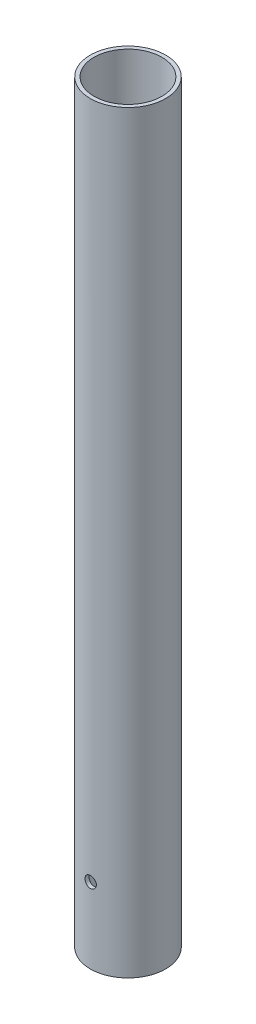
ISO-10303-21;
HEADER;
FILE_DESCRIPTION(('STEP AP214'),'2;1');
FILE_NAME('part.step','',(''),(''),'','','');
FILE_SCHEMA(('AUTOMOTIVE_DESIGN { 1 0 10303 214 1 1 1 1 }'));
ENDSEC;
DATA;
#1=APPLICATION_CONTEXT('core data for automotive mechanical design processes');
#2=APPLICATION_PROTOCOL_DEFINITION('international standard','automotive_design',2000,#1);
#3=PRODUCT_CONTEXT('',#1,'mechanical');
#4=PRODUCT('Part','Part','',(#3));
#5=PRODUCT_RELATED_PRODUCT_CATEGORY('part','',(#4));
#6=PRODUCT_DEFINITION_FORMATION('','',#4);
#7=PRODUCT_DEFINITION_CONTEXT('part definition',#1,'design');
#8=PRODUCT_DEFINITION('design','',#6,#7);
#9=PRODUCT_DEFINITION_SHAPE('','',#8);
#10=(LENGTH_UNIT() NAMED_UNIT(*) SI_UNIT(.MILLI.,.METRE.));
#11=(NAMED_UNIT(*) PLANE_ANGLE_UNIT() SI_UNIT($,.RADIAN.));
#12=(NAMED_UNIT(*) SI_UNIT($,.STERADIAN.) SOLID_ANGLE_UNIT());
#13=UNCERTAINTY_MEASURE_WITH_UNIT(LENGTH_MEASURE(1.E-05),#10,'distance_accuracy_value','');
#14=(GEOMETRIC_REPRESENTATION_CONTEXT(3) GLOBAL_UNCERTAINTY_ASSIGNED_CONTEXT((#13)) GLOBAL_UNIT_ASSIGNED_CONTEXT((#10,
#11,#12)) REPRESENTATION_CONTEXT('',''));
#15=CARTESIAN_POINT('',(0.,0.,0.));
#16=DIRECTION('',(0.,0.,1.));
#17=DIRECTION('',(1.,0.,0.));
#18=AXIS2_PLACEMENT_3D('',#15,#16,#17);
#19=CARTESIAN_POINT('',(0.,200.,0.));
#20=DIRECTION('',(0.,1.,0.));
#21=DIRECTION('',(0.,0.,1.));
#22=AXIS2_PLACEMENT_3D('',#19,#20,#21);
#23=PLANE('',#22);
#24=CARTESIAN_POINT('',(0.,200.,0.));
#25=DIRECTION('',(0.,1.,0.));
#26=DIRECTION('',(0.,0.,1.));
#27=AXIS2_PLACEMENT_3D('',#24,#25,#26);
#28=CIRCLE('',#27,10.);
#29=CARTESIAN_POINT('',(0.,200.,10.));
#30=VERTEX_POINT('',#29);
#31=EDGE_CURVE('E10',#30,#30,#28,.T.);
#32=ORIENTED_EDGE('',*,*,#31,.T.);
#33=EDGE_LOOP('',(#32));
#34=FACE_BOUND('',#33,.T.);
#35=CARTESIAN_POINT('',(0.,200.,0.));
#36=DIRECTION('',(0.,1.,0.));
#37=DIRECTION('',(0.,0.,1.));
#38=AXIS2_PLACEMENT_3D('',#35,#36,#37);
#39=CIRCLE('',#38,9.);
#40=CARTESIAN_POINT('',(0.,200.,9.));
#41=VERTEX_POINT('',#40);
#42=EDGE_CURVE('E49',#41,#41,#39,.T.);
#43=ORIENTED_EDGE('',*,*,#42,.F.);
#44=EDGE_LOOP('',(#43));
#45=FACE_BOUND('',#44,.T.);
#46=ADVANCED_FACE('F31',(#34,#45),#23,.T.);
#47=CARTESIAN_POINT('',(0.,0.,0.));
#48=DIRECTION('',(0.,1.,0.));
#49=DIRECTION('',(0.,0.,1.));
#50=AXIS2_PLACEMENT_3D('',#47,#48,#49);
#51=PLANE('',#50);
#52=CARTESIAN_POINT('',(0.,0.,0.));
#53=DIRECTION('',(0.,1.,0.));
#54=DIRECTION('',(0.,0.,1.));
#55=AXIS2_PLACEMENT_3D('',#52,#53,#54);
#56=CIRCLE('',#55,10.);
#57=CARTESIAN_POINT('',(0.,0.,10.));
#58=VERTEX_POINT('',#57);
#59=EDGE_CURVE('E44',#58,#58,#56,.T.);
#60=ORIENTED_EDGE('',*,*,#59,.F.);
#61=EDGE_LOOP('',(#60));
#62=FACE_BOUND('',#61,.T.);
#63=CARTESIAN_POINT('',(0.,0.,0.));
#64=DIRECTION('',(0.,1.,0.));
#65=DIRECTION('',(0.,0.,1.));
#66=AXIS2_PLACEMENT_3D('',#63,#64,#65);
#67=CIRCLE('',#66,9.);
#68=CARTESIAN_POINT('',(0.,0.,9.));
#69=VERTEX_POINT('',#68);
#70=EDGE_CURVE('E52',#69,#69,#67,.T.);
#71=ORIENTED_EDGE('',*,*,#70,.T.);
#72=EDGE_LOOP('',(#71));
#73=FACE_BOUND('',#72,.T.);
#74=ADVANCED_FACE('F85',(#62,#73),#51,.F.);
#75=CARTESIAN_POINT('',(0.,200.,0.));
#76=DIRECTION('',(0.,-1.,0.));
#77=DIRECTION('',(0.,0.,-1.));
#78=AXIS2_PLACEMENT_3D('',#75,#76,#77);
#79=CYLINDRICAL_SURFACE('',#78,10.);
#80=CARTESIAN_POINT('',(0.,21.5,-10.));
#81=CARTESIAN_POINT('',(-0.0837515444816428,21.4999965461847,-9.99999865771297));
#82=CARTESIAN_POINT('',(-0.167551685082133,21.4929619991594,-9.9989368253704));
#83=CARTESIAN_POINT('',(-0.332809627994915,21.4650168000173,-9.99480315973187));
#84=CARTESIAN_POINT('',(-0.41426506897423,21.4440926370551,-9.99172936938473));
#85=CARTESIAN_POINT('',(-0.572418086221861,21.3890074950324,-9.98391721219526));
#86=CARTESIAN_POINT('',(-0.649119207826801,21.3548565204941,-9.97918010370919));
#87=CARTESIAN_POINT('',(-0.795690428635256,21.2743116205831,-9.96856475911724));
#88=CARTESIAN_POINT('',(-0.865561474725191,21.2279193955826,-9.96268668152773));
#89=CARTESIAN_POINT('',(-0.997046719562128,21.1238227350601,-9.95039170991452));
#90=CARTESIAN_POINT('',(-1.0585998322255,21.0660415437918,-9.94397133890331));
#91=CARTESIAN_POINT('',(-1.17117490668949,20.9409723111061,-9.93134261133238));
#92=CARTESIAN_POINT('',(-1.22219626272936,20.8736837232215,-9.92513426698505));
#93=CARTESIAN_POINT('',(-1.31249729499943,20.7310993564775,-9.91359877458726));
#94=CARTESIAN_POINT('',(-1.35171787037205,20.6557657530187,-9.90827611975031));
#95=CARTESIAN_POINT('',(-1.41692632171056,20.4994871793546,-9.89916211306268));
#96=CARTESIAN_POINT('',(-1.44291491889163,20.4185425152561,-9.89537067775448));
#97=CARTESIAN_POINT('',(-1.48073198798911,20.2539819581283,-9.88978256218673));
#98=CARTESIAN_POINT('',(-1.49266503640518,20.170390606592,-9.8879711574125));
#99=CARTESIAN_POINT('',(-1.50235624033932,20.0023738340127,-9.88650348970582));
#100=CARTESIAN_POINT('',(-1.50011520973796,19.9179484611375,-9.88684710303147));
#101=CARTESIAN_POINT('',(-1.48160733250788,19.7513989198059,-9.88963718352409));
#102=CARTESIAN_POINT('',(-1.4654569592775,19.6692614735152,-9.89206618761549));
#103=CARTESIAN_POINT('',(-1.41977117403734,19.5088756311285,-9.89872608126367));
#104=CARTESIAN_POINT('',(-1.39023538337812,19.4306273451193,-9.90295702179379));
#105=CARTESIAN_POINT('',(-1.31849603529737,19.2798866287171,-9.91276335545481));
#106=CARTESIAN_POINT('',(-1.27624314283198,19.2074180309076,-9.91834396766526));
#107=CARTESIAN_POINT('',(-1.18030413128955,19.0705554042181,-9.93021707574548));
#108=CARTESIAN_POINT('',(-1.12661726182478,19.0061619057306,-9.93650961832501));
#109=CARTESIAN_POINT('',(-1.00869493078248,18.8866023392603,-9.94917473056209));
#110=CARTESIAN_POINT('',(-0.944359329642002,18.8315350097137,-9.95554747112815));
#111=CARTESIAN_POINT('',(-0.807307089894185,18.7329640654927,-9.96759647648462));
#112=CARTESIAN_POINT('',(-0.734590414588169,18.6894605014561,-9.9732727382251));
#113=CARTESIAN_POINT('',(-0.582754598213683,18.6152469135004,-9.98329515585393));
#114=CARTESIAN_POINT('',(-0.503631677836776,18.5845445081597,-9.98764051925428));
#115=CARTESIAN_POINT('',(-0.341273182487057,18.5368906103146,-9.99450490557069));
#116=CARTESIAN_POINT('',(-0.258037885952597,18.5199381881844,-9.99702405195467));
#117=CARTESIAN_POINT('',(-0.0906695676436442,18.5003967701833,-9.99993581133871));
#118=CARTESIAN_POINT('',(-0.00655273187046845,18.4976720286207,-10.0003485209039));
#119=CARTESIAN_POINT('',(0.160936677662285,18.506303005311,-9.99905561015226));
#120=CARTESIAN_POINT('',(0.244309274381879,18.5176582876681,-9.99735005541369));
#121=CARTESIAN_POINT('',(0.40753238743141,18.5540141001775,-9.99202468615333));
#122=CARTESIAN_POINT('',(0.48739796307984,18.5789484960308,-9.98841415207984));
#123=CARTESIAN_POINT('',(0.641814958643002,18.6416849974618,-9.97968235658369));
#124=CARTESIAN_POINT('',(0.716366128795103,18.6794877073336,-9.97456102421565));
#125=CARTESIAN_POINT('',(0.858634979291924,18.7672062245639,-9.96332682468686));
#126=CARTESIAN_POINT('',(0.926299009891569,18.8172081400128,-9.95720701626745));
#127=CARTESIAN_POINT('',(1.05232367317771,18.9277858116287,-9.94467863012165));
#128=CARTESIAN_POINT('',(1.11068376479341,18.9883621823247,-9.93827003562867));
#129=CARTESIAN_POINT('',(1.21693784957196,19.1189735331765,-9.92582264304494));
#130=CARTESIAN_POINT('',(1.26474084747421,19.1890829251948,-9.91978736017588));
#131=CARTESIAN_POINT('',(1.34789129270584,19.3364160405118,-9.90883219104903));
#132=CARTESIAN_POINT('',(1.38323907656436,19.4136395715215,-9.90391227465628));
#133=CARTESIAN_POINT('',(1.44033467323944,19.5727375336231,-9.89577033008645));
#134=CARTESIAN_POINT('',(1.46213037141636,19.6545944609712,-9.89254233006438));
#135=CARTESIAN_POINT('',(1.49165549501586,19.8208590154351,-9.88813382297802));
#136=CARTESIAN_POINT('',(1.49938589183067,19.9052664659947,-9.88695317451771));
#137=CARTESIAN_POINT('',(1.5005378666944,20.0733290633158,-9.88677832610841));
#138=CARTESIAN_POINT('',(1.49410252167313,20.1569832417569,-9.88776226333502));
#139=CARTESIAN_POINT('',(1.46741229544379,20.3220052633235,-9.89175820611174));
#140=CARTESIAN_POINT('',(1.44715743638627,20.4033731101134,-9.89477020841118));
#141=CARTESIAN_POINT('',(1.39345373518665,20.5614730822343,-9.90247526112297));
#142=CARTESIAN_POINT('',(1.36001489324314,20.6382086704334,-9.90716703716075));
#143=CARTESIAN_POINT('',(1.28090667642309,20.7850036338024,-9.91770454557702));
#144=CARTESIAN_POINT('',(1.23523688741502,20.8550627828036,-9.92355031702724));
#145=CARTESIAN_POINT('',(1.13244337659164,20.9872430579752,-9.93580743364938));
#146=CARTESIAN_POINT('',(1.07521369039806,21.0492813332471,-9.94222367881967));
#147=CARTESIAN_POINT('',(0.951148841082834,21.1629245547878,-9.95485788826636));
#148=CARTESIAN_POINT('',(0.88431144835094,21.2145270725762,-9.96107580610759));
#149=CARTESIAN_POINT('',(0.742495707543721,21.3060876766074,-9.9726518579052));
#150=CARTESIAN_POINT('',(0.667474576764759,21.3459801092148,-9.9780050712882));
#151=CARTESIAN_POINT('',(0.511751870248718,21.412538516758,-9.98720028802959));
#152=CARTESIAN_POINT('',(0.431056277096703,21.4392181900537,-9.99104385565757));
#153=CARTESIAN_POINT('',(0.291665727889329,21.4725413427101,-9.99590939261505));
#154=CARTESIAN_POINT('',(0.233831133495278,21.4828226015388,-9.99743549179557));
#155=CARTESIAN_POINT('',(0.117338971600125,21.4965530977126,-9.99948125947896));
#156=CARTESIAN_POINT('',(0.0586814143344173,21.5000024199525,-10.0000009404877));
#157=CARTESIAN_POINT('',(0.,21.5,-10.));
#158=B_SPLINE_CURVE_WITH_KNOTS('',3,(#80,#81,#82,#83,#84,#85,#86,#87,#88,#89,#90,#91,#92,#93,
#94,#95,#96,#97,#98,#99,#100,#101,#102,#103,#104,#105,#106,#107,#108,#109,#110,#111,#112,#113,
#114,#115,#116,#117,#118,#119,#120,#121,#122,#123,#124,#125,#126,#127,#128,#129,#130,#131,#132,
#133,#134,#135,#136,#137,#138,#139,#140,#141,#142,#143,#144,#145,#146,#147,#148,#149,#150,#151,
#152,#153,#154,#155,#156,#157),.UNSPECIFIED.,.T.,.F.,(4,2,2,2,2,2,2,2,2,2,2,2,2,2,2,2,2,2,2,2,2,
2,2,2,2,2,2,2,2,2,2,2,2,2,2,2,2,2,4),(0.,0.251040205031664,0.502324962929151,0.753420023583238,
1.0044802241976,1.25729416136843,1.5101226357258,1.76419702395375,2.01825756225506,
2.27041564605925,2.52255925098983,2.77261177195747,3.02267136690362,3.27371383476159,
3.52477278308534,3.77834291255409,4.03191415238669,4.28563608984875,4.53934087193402,
4.79062058544256,5.04189251991155,5.29195148965949,5.54202220376274,5.79391188036908,
6.0458162002863,6.29981366584673,6.55380426808833,6.80689223457169,7.05996272137177,
7.31048888261065,7.56101464229564,7.81135073984147,8.0616953146688,8.31444829965722,
8.56726003468733,8.82146323384734,9.07540233261442,9.25129851978809,9.42719252123291),.UNSPECIFIED.);
#159=CARTESIAN_POINT('',(0.,21.5,-10.));
#160=VERTEX_POINT('',#159);
#161=EDGE_CURVE('E75',#160,#160,#158,.T.);
#162=ORIENTED_EDGE('',*,*,#161,.T.);
#163=EDGE_LOOP('',(#162));
#164=FACE_BOUND('',#163,.T.);
#165=CARTESIAN_POINT('',(1.5,20.,9.88685996664259));
#166=CARTESIAN_POINT('',(1.49999654107284,19.91625443071,9.88686136668593));
#167=CARTESIAN_POINT('',(1.49296296388491,19.8324602492493,9.88793551739101));
#168=CARTESIAN_POINT('',(1.46502196657001,19.6672146851169,9.8921131480324));
#169=CARTESIAN_POINT('',(1.44410101402628,19.58576566852,9.8952186073143));
#170=CARTESIAN_POINT('',(1.38902526098084,19.4276262445531,9.90309938986228));
#171=CARTESIAN_POINT('',(1.35488061681397,19.3509322374578,9.90787343131536));
#172=CARTESIAN_POINT('',(1.27435063087791,19.2043729692279,9.91855194113145));
#173=CARTESIAN_POINT('',(1.22796697429872,19.1345067697857,9.92445625383668));
#174=CARTESIAN_POINT('',(1.12387902418558,19.0030161832457,9.9367828924804));
#175=CARTESIAN_POINT('',(1.0660960558482,18.9414543865933,9.94320862458057));
#176=CARTESIAN_POINT('',(0.941019605444373,18.8288625143445,9.95582368169047));
#177=CARTESIAN_POINT('',(0.873725600786529,18.777833017833,9.96201299368615));
#178=CARTESIAN_POINT('',(0.731136358052745,18.6875233683086,9.97349347428185));
#179=CARTESIAN_POINT('',(0.655804227365767,18.6483008496775,9.97878018435569));
#180=CARTESIAN_POINT('',(0.499528850106974,18.5830884011918,9.98782206746405));
#181=CARTESIAN_POINT('',(0.418585900270676,18.5570977721571,9.99157732141945));
#182=CARTESIAN_POINT('',(0.254031123090568,18.5192766114692,9.99710914797782));
#183=CARTESIAN_POINT('',(0.170443884389865,18.5073412736128,9.99890035887344));
#184=CARTESIAN_POINT('',(0.00243520401947719,18.4976440651751,10.0003524476958));
#185=CARTESIAN_POINT('',(-0.0819861910157481,18.4998814066803,10.0000134440494));
#186=CARTESIAN_POINT('',(-0.248551718200522,18.5183833377624,9.99725499660796));
#187=CARTESIAN_POINT('',(-0.330708691400009,18.5345351717915,9.99485227652479));
#188=CARTESIAN_POINT('',(-0.491132829143139,18.5802306063226,9.98825500227851));
#189=CARTESIAN_POINT('',(-0.569399893513483,18.6097745515014,9.98406040199739));
#190=CARTESIAN_POINT('',(-0.720163780770318,18.6815309969171,9.97432193873206));
#191=CARTESIAN_POINT('',(-0.792637672323598,18.7237909651087,9.96877303515638));
#192=CARTESIAN_POINT('',(-0.929507907150179,18.81974519367,9.95694438245421));
#193=CARTESIAN_POINT('',(-0.993903718271737,18.8734402067069,9.95066458523184));
#194=CARTESIAN_POINT('',(-1.11345448272265,18.9913684488266,9.93800158192627));
#195=CARTESIAN_POINT('',(-1.16851232950947,19.0557001219701,9.93161796623256));
#196=CARTESIAN_POINT('',(-1.26706599338813,19.1927410771237,9.91952704453523));
#197=CARTESIAN_POINT('',(-1.31056173927999,19.2654504107199,9.91381974269649));
#198=CARTESIAN_POINT('',(-1.38476964534605,19.4172839629406,9.90372775286855));
#199=CARTESIAN_POINT('',(-1.41547182270082,19.4964131336624,9.89934409845291));
#200=CARTESIAN_POINT('',(-1.46312336208879,19.6587852551474,9.89241402899059));
#201=CARTESIAN_POINT('',(-1.48007369337326,19.7420279155468,9.88986748446299));
#202=CARTESIAN_POINT('',(-1.49960720086656,19.9094000895775,9.88692451395027));
#203=CARTESIAN_POINT('',(-1.50232803265052,19.9935131882015,9.88650748802574));
#204=CARTESIAN_POINT('',(-1.49369057019819,20.1609941948173,9.88781607937153));
#205=CARTESIAN_POINT('',(-1.48233271282302,20.2443621258508,9.88954163015778));
#206=CARTESIAN_POINT('',(-1.44597702952766,20.4075598179656,9.89492202461453));
#207=CARTESIAN_POINT('',(-1.42104778527821,20.4874052049416,9.89856716482858));
#208=CARTESIAN_POINT('',(-1.35832831947087,20.6417840920486,9.90736801825768));
#209=CARTESIAN_POINT('',(-1.32053746276389,20.7163173296282,9.91252380607176));
#210=CARTESIAN_POINT('',(-1.23283677995324,20.858573260335,9.92381355687063));
#211=CARTESIAN_POINT('',(-1.18283784561766,20.9262404472798,9.92995459279988));
#212=CARTESIAN_POINT('',(-1.07226416837201,21.0522728598738,9.94250159433355));
#213=CARTESIAN_POINT('',(-1.0116888274468,21.1106375591812,9.94890757490292));
#214=CARTESIAN_POINT('',(-0.881075619628183,21.2169026066336,9.96132705217386));
#215=CARTESIAN_POINT('',(-0.810963126771956,21.2647117282425,9.96733683460423));
#216=CARTESIAN_POINT('',(-0.663622080263679,21.3478729052626,9.97822905032016));
#217=CARTESIAN_POINT('',(-0.586393721360436,21.383225301465,9.98311151444563));
#218=CARTESIAN_POINT('',(-0.427297995861143,21.440323742488,9.99118269660795));
#219=CARTESIAN_POINT('',(-0.345448858754299,21.4621196670784,9.99437761717899));
#220=CARTESIAN_POINT('',(-0.17920081550119,21.4916478795375,9.99873976656896));
#221=CARTESIAN_POINT('',(-0.0948020781305786,21.4993810962491,9.99990712930801));
#222=CARTESIAN_POINT('',(0.0732645908608203,21.5005417045494,10.0000812905914));
#223=CARTESIAN_POINT('',(0.156931570212054,21.494108680877,9.99910917023796));
#224=CARTESIAN_POINT('',(0.321979795323109,21.4674186115792,9.99515610519141));
#225=CARTESIAN_POINT('',(0.403361048396515,21.4471616101914,9.99217516692666));
#226=CARTESIAN_POINT('',(0.561489374379663,21.3934481244298,9.98453786742463));
#227=CARTESIAN_POINT('',(0.638239793148784,21.3600013048611,9.97988273316947));
#228=CARTESIAN_POINT('',(0.785061117896604,21.2808725120169,9.96940834495499));
#229=CARTESIAN_POINT('',(0.85513180692071,21.2351901415197,9.96358905320338));
#230=CARTESIAN_POINT('',(0.987312585191961,21.1323823011708,9.95136510636178));
#231=CARTESIAN_POINT('',(1.04934206644639,21.0751537741837,9.94495548425942));
#232=CARTESIAN_POINT('',(1.16296808390268,20.9510949269195,9.93231001689001));
#233=CARTESIAN_POINT('',(1.21456216798984,20.8842623561757,9.92607421276291));
#234=CARTESIAN_POINT('',(1.30611310822974,20.7424510167675,9.91444484029116));
#235=CARTESIAN_POINT('',(1.34600294291209,20.6674285829782,9.90905620156985));
#236=CARTESIAN_POINT('',(1.41255613872045,20.5117032232367,9.89978909110724));
#237=CARTESIAN_POINT('',(1.43923322574898,20.4310062921422,9.89590905307931));
#238=CARTESIAN_POINT('',(1.47254951890026,20.2916225637435,9.89099485524825));
#239=CARTESIAN_POINT('',(1.4828276978042,20.2337966030757,9.88945249382379));
#240=CARTESIAN_POINT('',(1.49655410576574,20.1173217082656,9.88738456567011));
#241=CARTESIAN_POINT('',(1.50000242335076,20.0586727848004,9.88685898576155));
#242=CARTESIAN_POINT('',(1.5,20.,9.88685996664259));
#243=B_SPLINE_CURVE_WITH_KNOTS('',3,(#165,#166,#167,#168,#169,#170,#171,#172,#173,#174,#175,
#176,#177,#178,#179,#180,#181,#182,#183,#184,#185,#186,#187,#188,#189,#190,#191,#192,#193,#194,
#195,#196,#197,#198,#199,#200,#201,#202,#203,#204,#205,#206,#207,#208,#209,#210,#211,#212,#213,
#214,#215,#216,#217,#218,#219,#220,#221,#222,#223,#224,#225,#226,#227,#228,#229,#230,#231,#232,
#233,#234,#235,#236,#237,#238,#239,#240,#241,#242),.UNSPECIFIED.,.T.,.F.,(4,2,2,2,2,2,2,2,2,2,2,
2,2,2,2,2,2,2,2,2,2,2,2,2,2,2,2,2,2,2,2,2,2,2,2,2,2,2,4),(0.,0.251022251804869,
0.502289469561804,0.753364085335676,1.00440414866133,1.25724158649108,1.51009292207817,
1.76415922105782,2.01821209364501,2.27035832534397,2.52249053939374,2.77259862515728,
3.02271314839402,3.27377316386454,3.52484970949273,3.7783954466627,4.0319427451435,
4.28568751773138,4.53941440444341,4.79068214603744,5.04194209099919,5.29194394807375,
5.54195815286118,5.79385486001303,6.04576581461802,6.29977537753517,6.55377799071855,
6.80684040891091,7.05988611170474,7.31044963622327,7.56101235892824,7.81139182257834,
8.06177941567107,8.3145095001097,8.56729890236863,8.82150878824932,9.07545403445564,
9.25132441891614,9.42719252376193),.UNSPECIFIED.);
#244=CARTESIAN_POINT('',(1.5,20.,9.88685996664259));
#245=VERTEX_POINT('',#244);
#246=EDGE_CURVE('E71',#245,#245,#243,.T.);
#247=ORIENTED_EDGE('',*,*,#246,.T.);
#248=EDGE_LOOP('',(#247));
#249=FACE_BOUND('',#248,.T.);
#250=ORIENTED_EDGE('',*,*,#31,.F.);
#251=EDGE_LOOP('',(#250));
#252=FACE_BOUND('',#251,.T.);
#253=ORIENTED_EDGE('',*,*,#59,.T.);
#254=EDGE_LOOP('',(#253));
#255=FACE_BOUND('',#254,.T.);
#256=ADVANCED_FACE('F33',(#164,#249,#252,#255),#79,.T.);
#257=CARTESIAN_POINT('',(0.,200.,0.));
#258=DIRECTION('',(0.,-1.,0.));
#259=DIRECTION('',(0.,0.,-1.));
#260=AXIS2_PLACEMENT_3D('',#257,#258,#259);
#261=CYLINDRICAL_SURFACE('',#260,9.);
#262=CARTESIAN_POINT('',(0.,21.5,-9.));
#263=CARTESIAN_POINT('',(-0.0836345429749295,21.4999966466313,-8.99999856701294));
#264=CARTESIAN_POINT('',(-0.167314729103294,21.4929816350186,-8.9988220674782));
#265=CARTESIAN_POINT('',(-0.332328133003827,21.4651186047408,-8.99424206964832));
#266=CARTESIAN_POINT('',(-0.413659120775549,21.444257865853,-8.99083652354334));
#267=CARTESIAN_POINT('',(-0.571562848327587,21.3893507308443,-8.9821804094187));
#268=CARTESIAN_POINT('',(-0.64813942105914,21.3553151206157,-8.97693135095516));
#269=CARTESIAN_POINT('',(-0.794485105186767,21.2750526247686,-8.96516536249242));
#270=CARTESIAN_POINT('',(-0.864254993927156,21.2288271335102,-8.9586485775266));
#271=CARTESIAN_POINT('',(-0.99568356857501,21.1250269497077,-8.94499990474988));
#272=CARTESIAN_POINT('',(-1.05726774212098,21.0673585312183,-8.93786323088914));
#273=CARTESIAN_POINT('',(-1.16993309919596,20.9425112189163,-8.92381576126039));
#274=CARTESIAN_POINT('',(-1.22101361963459,20.875331725126,-8.916904979776));
#275=CARTESIAN_POINT('',(-1.31152027536308,20.7328574202818,-8.90404539455868));
#276=CARTESIAN_POINT('',(-1.3508727317166,20.6575151979171,-8.89810277454982));
#277=CARTESIAN_POINT('',(-1.41633501924673,20.5011742614196,-8.88791873876805));
#278=CARTESIAN_POINT('',(-1.44244574493937,20.4201759297934,-8.88367720808584));
#279=CARTESIAN_POINT('',(-1.48044862667089,20.2556118350861,-8.87742322105653));
#280=CARTESIAN_POINT('',(-1.49246941748124,20.1720765580992,-8.8753906109142));
#281=CARTESIAN_POINT('',(-1.50235003517393,20.0041518338699,-8.87372363361989));
#282=CARTESIAN_POINT('',(-1.5002108642334,19.9197624474996,-8.87408909674328));
#283=CARTESIAN_POINT('',(-1.48193705903769,19.7534432832347,-8.87715857318133));
#284=CARTESIAN_POINT('',(-1.46594692913386,19.6714971178729,-8.8798384399135));
#285=CARTESIAN_POINT('',(-1.42065188424207,19.5114672093025,-8.88719697126605));
#286=CARTESIAN_POINT('',(-1.39134651259185,19.4333835986669,-8.89187570443963));
#287=CARTESIAN_POINT('',(-1.32010634765635,19.2828627059354,-8.9027308760046));
#288=CARTESIAN_POINT('',(-1.27811154832783,19.2104543563513,-8.90891440264395));
#289=CARTESIAN_POINT('',(-1.18272721053446,19.073657359677,-8.92207751049005));
#290=CARTESIAN_POINT('',(-1.12933675239257,19.009269360527,-8.92905715592572));
#291=CARTESIAN_POINT('',(-1.01188932729543,18.8895043485156,-8.94313216727871));
#292=CARTESIAN_POINT('',(-0.947708378323879,18.834248888876,-8.95022789538991));
#293=CARTESIAN_POINT('',(-0.810921149388989,18.7352733424008,-8.96365560838034));
#294=CARTESIAN_POINT('',(-0.738314815143853,18.6915533298901,-8.96998758833847));
#295=CARTESIAN_POINT('',(-0.586623549700025,18.6168786637182,-8.98118335735747));
#296=CARTESIAN_POINT('',(-0.507533235338795,18.5859347484012,-8.98604591044468));
#297=CARTESIAN_POINT('',(-0.345179007361637,18.5378034708524,-8.99374501807596));
#298=CARTESIAN_POINT('',(-0.261915443507679,18.5206149578158,-8.99658174210284));
#299=CARTESIAN_POINT('',(-0.0946259407809727,18.5006471849233,-8.99988677905612));
#300=CARTESIAN_POINT('',(-0.0106204422906052,18.4977010569166,-9.00038251807671));
#301=CARTESIAN_POINT('',(0.156683863733934,18.5058568066569,-8.99902484652702));
#302=CARTESIAN_POINT('',(0.239982698335225,18.5169581438802,-8.99717152634471));
#303=CARTESIAN_POINT('',(0.40299370532806,18.5527549096013,-8.99134096162921));
#304=CARTESIAN_POINT('',(0.48272452103123,18.5773677250341,-8.98737662880787));
#305=CARTESIAN_POINT('',(0.636928130916268,18.6394007109197,-8.97776678673215));
#306=CARTESIAN_POINT('',(0.711400629545834,18.6768216005812,-8.97212118307212));
#307=CARTESIAN_POINT('',(0.853698413681377,18.7637906748181,-8.95970709781444));
#308=CARTESIAN_POINT('',(0.92145915056229,18.8134430937004,-8.95292913532213));
#309=CARTESIAN_POINT('',(1.04774615130161,18.923322389231,-8.93903080435141));
#310=CARTESIAN_POINT('',(1.10627174381795,18.983550033966,-8.93191041102928));
#311=CARTESIAN_POINT('',(1.2130456677948,19.1136185288429,-8.91804105141507));
#312=CARTESIAN_POINT('',(1.26118125666823,19.1835524993086,-8.91129669682264));
#313=CARTESIAN_POINT('',(1.34502138617699,19.3306117814831,-8.8990291786673));
#314=CARTESIAN_POINT('',(1.38072632086189,19.4077368651365,-8.89350597639612));
#315=CARTESIAN_POINT('',(1.43852299888389,19.5666738396873,-8.88434072218623));
#316=CARTESIAN_POINT('',(1.46067085952877,19.6484648570183,-8.88069092586639));
#317=CARTESIAN_POINT('',(1.49090127226697,19.8146720775331,-8.87566630101156));
#318=CARTESIAN_POINT('',(1.4989850471677,19.8990880518392,-8.87429127469633));
#319=CARTESIAN_POINT('',(1.50082371962841,20.0670230995774,-8.87398039850407));
#320=CARTESIAN_POINT('',(1.49475608167511,20.1505402271452,-8.8750143390339));
#321=CARTESIAN_POINT('',(1.46884790337411,20.3153475488305,-8.87933868872237));
#322=CARTESIAN_POINT('',(1.44900740766749,20.3966377501651,-8.88262909056728));
#323=CARTESIAN_POINT('',(1.39618469375694,20.5546150623756,-8.89108413769031));
#324=CARTESIAN_POINT('',(1.36321775436027,20.6313074060336,-8.89624660331802));
#325=CARTESIAN_POINT('',(1.28509620234955,20.7781014015169,-8.90786621353324));
#326=CARTESIAN_POINT('',(1.23994098524914,20.8482027262233,-8.9143234223304));
#327=CARTESIAN_POINT('',(1.13809133062329,20.9807213498647,-8.92790072427373));
#328=CARTESIAN_POINT('',(1.08126633815619,21.0430376100202,-8.93502777345781));
#329=CARTESIAN_POINT('',(0.957965418828136,21.157310962685,-8.94908623416504));
#330=CARTESIAN_POINT('',(0.891487267747581,21.2092656611829,-8.95601760015928));
#331=CARTESIAN_POINT('',(0.750221501784168,21.30166896092,-8.96895917785332));
#332=CARTESIAN_POINT('',(0.675379672519689,21.3420356235878,-8.97496269751862));
#333=CARTESIAN_POINT('',(0.519907841627387,21.409561690766,-8.98530700561065));
#334=CARTESIAN_POINT('',(0.439283696898005,21.4367342486478,-8.98964944906489));
#335=CARTESIAN_POINT('',(0.29862198602724,21.471203164476,-8.99523474499773));
#336=CARTESIAN_POINT('',(0.239435298179068,21.4819846817696,-8.99701216364015));
#337=CARTESIAN_POINT('',(0.120173586191886,21.4963842427069,-8.99939529591672));
#338=CARTESIAN_POINT('',(0.0600985773650966,21.5000024096824,-9.00000102972385));
#339=CARTESIAN_POINT('',(0.,21.5,-9.));
#340=B_SPLINE_CURVE_WITH_KNOTS('',3,(#262,#263,#264,#265,#266,#267,#268,#269,#270,#271,#272,
#273,#274,#275,#276,#277,#278,#279,#280,#281,#282,#283,#284,#285,#286,#287,#288,#289,#290,#291,
#292,#293,#294,#295,#296,#297,#298,#299,#300,#301,#302,#303,#304,#305,#306,#307,#308,#309,#310,
#311,#312,#313,#314,#315,#316,#317,#318,#319,#320,#321,#322,#323,#324,#325,#326,#327,#328,#329,
#330,#331,#332,#333,#334,#335,#336,#337,#338,#339),.UNSPECIFIED.,.T.,.F.,(4,2,2,2,2,2,2,2,2,2,2,
2,2,2,2,2,2,2,2,2,2,2,2,2,2,2,2,2,2,2,2,2,2,2,2,2,2,2,4),(0.,0.250683950963107,
0.501598527417252,0.752308120215161,1.00298904760487,1.25581494637399,1.50865680101914,
1.76305512494304,2.01743626125709,2.26947646262054,2.52149882592532,2.77092313056245,
3.02035599015229,3.27098733979535,3.52163892408344,3.77539661946796,4.02915594981509,
4.28312813349542,4.5370790671269,4.78804730094839,5.03900587821516,5.2884468420385,
5.53790181495641,5.78956095376215,6.0412383783257,6.29552293204572,6.54979942425566,
6.80301613405064,7.05621082671972,7.30624745713621,7.55628327712881,7.80602890935734,
8.05578693017602,8.30850830516036,8.56128800327384,8.81581338964321,9.07008451278044,
9.25022548898412,9.43036336366182),.UNSPECIFIED.);
#341=CARTESIAN_POINT('',(0.,21.5,-9.));
#342=VERTEX_POINT('',#341);
#343=EDGE_CURVE('E36',#342,#342,#340,.T.);
#344=ORIENTED_EDGE('',*,*,#343,.F.);
#345=EDGE_LOOP('',(#344));
#346=FACE_BOUND('',#345,.T.);
#347=CARTESIAN_POINT('',(1.5,20.,8.87411967464942));
#348=CARTESIAN_POINT('',(1.4999966390526,19.9163745511124,8.87412118440766));
#349=CARTESIAN_POINT('',(1.49298310142239,19.8327034363851,8.8753145552884));
#350=CARTESIAN_POINT('',(1.46512645684524,19.6677088740679,8.87995474420907));
#351=CARTESIAN_POINT('',(1.44427059618579,19.5863876637503,8.88340364034856));
#352=CARTESIAN_POINT('',(1.38937772620029,19.4285046299859,8.89215365593394));
#353=CARTESIAN_POINT('',(1.35535173295865,19.3519388908002,8.8974532270317));
#354=CARTESIAN_POINT('',(1.27511189813422,19.2056114271718,8.90930563268603));
#355=CARTESIAN_POINT('',(1.22889942810094,19.1358489382543,8.91585832618484));
#356=CARTESIAN_POINT('',(1.12511251617978,19.0044122901526,8.92955082691565));
#357=CARTESIAN_POINT('',(1.06744142935937,18.9428149211681,8.93669530396241));
#358=CARTESIAN_POINT('',(0.942583202817206,18.8301240158831,8.95072488401674));
#359=CARTESIAN_POINT('',(0.875395499489995,18.7790311021308,8.95760997163182));
#360=CARTESIAN_POINT('',(0.732913721969004,18.6885112596684,8.97039442189482));
#361=CARTESIAN_POINT('',(0.657573648874023,18.6491557953609,8.97628765459366));
#362=CARTESIAN_POINT('',(0.501237373034324,18.5836873576817,8.98637242174293));
#363=CARTESIAN_POINT('',(0.420241538446914,18.5575735232691,8.99056406683605));
#364=CARTESIAN_POINT('',(0.255686235806545,18.5195644790097,8.99674040834628));
#365=CARTESIAN_POINT('',(0.172157332007563,18.5075402503972,8.99874511866543));
#366=CARTESIAN_POINT('',(0.00424517131547871,18.4976505475084,9.00039047605668));
#367=CARTESIAN_POINT('',(-0.0801380271173391,18.4997841108517,9.00003128381585));
#368=CARTESIAN_POINT('',(-0.246481311047326,18.5180488109169,8.99700515058833));
#369=CARTESIAN_POINT('',(-0.328457118420085,18.5340410980455,8.99436110215438));
#370=CARTESIAN_POINT('',(-0.488545187767076,18.5793506445479,8.98708787262982));
#371=CARTESIAN_POINT('',(-0.566657331990904,18.6086683097537,8.98245863107927));
#372=CARTESIAN_POINT('',(-0.71721368866959,18.6799343841892,8.97169619107174));
#373=CARTESIAN_POINT('',(-0.789630313811428,18.7219400072495,8.96555620396128));
#374=CARTESIAN_POINT('',(-0.926439317907985,18.817347693581,8.95245442842898));
#375=CARTESIAN_POINT('',(-0.990831046749526,18.8707506792265,8.94549257351481));
#376=CARTESIAN_POINT('',(-1.110582764068,18.9882072839716,8.93142160939558));
#377=CARTESIAN_POINT('',(-1.16582370135193,19.0523822569406,8.92431173838625));
#378=CARTESIAN_POINT('',(-1.26477275306884,19.1891522541295,8.91082775870883));
#379=CARTESIAN_POINT('',(-1.30848076111945,19.2617473560097,8.90445365682795));
#380=CARTESIAN_POINT('',(-1.38314666069297,19.4134349851265,8.8931625273709));
#381=CARTESIAN_POINT('',(-1.41409021636755,19.4925346988553,8.88824713981561));
#382=CARTESIAN_POINT('',(-1.46221792248937,19.6549094433845,8.88045713213928));
#383=CARTESIAN_POINT('',(-1.47940328446077,19.7381841058595,8.87758233232993));
#384=CARTESIAN_POINT('',(-1.49935913092756,19.9054796936973,8.8742337565327));
#385=CARTESIAN_POINT('',(-1.50229932474747,19.9894798278213,8.87373171455201));
#386=CARTESIAN_POINT('',(-1.49413362160948,20.1567720030145,8.87511020869417));
#387=CARTESIAN_POINT('',(-1.4830282671748,20.2400640713084,8.87699065279112));
#388=CARTESIAN_POINT('',(-1.44723140095686,20.4030366555145,8.88289612473011));
#389=CARTESIAN_POINT('',(-1.42262627438783,20.4827366839268,8.88690751151009));
#390=CARTESIAN_POINT('',(-1.36061891411537,20.6368820997677,8.89661143803301));
#391=CARTESIAN_POINT('',(-1.32321591486056,20.7113271725305,8.90230407834347));
#392=CARTESIAN_POINT('',(-1.23627400393754,20.8536047566437,8.91479477038436));
#393=CARTESIAN_POINT('',(-1.18662633849562,20.9213699436536,8.92160253360208));
#394=CARTESIAN_POINT('',(-1.07675367942479,21.047668119617,8.9355280000792));
#395=CARTESIAN_POINT('',(-1.01652794183043,21.1062004586658,8.94264572511199));
#396=CARTESIAN_POINT('',(-0.886456842197286,21.2129911356372,8.95647853270958));
#397=CARTESIAN_POINT('',(-0.816517952031719,21.2611362957707,8.96318865806803));
#398=CARTESIAN_POINT('',(-0.669446068769597,21.3449931962029,8.97537067459765));
#399=CARTESIAN_POINT('',(-0.592313308482377,21.3807053386843,8.98084260581985));
#400=CARTESIAN_POINT('',(-0.433379430900798,21.4385063503729,8.9899101490175));
#401=CARTESIAN_POINT('',(-0.351600337561567,21.460654445441,8.99351390740573));
#402=CARTESIAN_POINT('',(-0.185418440924528,21.4908893593783,8.99847349901568));
#403=CARTESIAN_POINT('',(-0.101015854092975,21.4989773352394,8.99982951720106));
#404=CARTESIAN_POINT('',(0.0669247654642088,21.5008291293873,9.00013822732695));
#405=CARTESIAN_POINT('',(0.150460896361608,21.4947651523646,8.99911981214543));
#406=CARTESIAN_POINT('',(0.315307184588815,21.4688576466384,8.9948530703237));
#407=CARTESIAN_POINT('',(0.396617354380456,21.4490141950943,8.99160475617001));
#408=CARTESIAN_POINT('',(0.554637867551156,21.3961771006737,8.98324193296551));
#409=CARTESIAN_POINT('',(0.631353223292414,21.3631980990737,8.97812950224933));
#410=CARTESIAN_POINT('',(0.77818827178918,21.2850452382619,8.96659654126411));
#411=CARTESIAN_POINT('',(0.84830765167048,21.2398708009634,8.96017594898929));
#412=CARTESIAN_POINT('',(0.980827767316296,21.1379989445228,8.94664577771383));
#413=CARTESIAN_POINT('',(1.04313085836337,21.0811754271459,8.9395291473044));
#414=CARTESIAN_POINT('',(1.15737832556883,20.9578830152611,8.92545781982851));
#415=CARTESIAN_POINT('',(1.20932027202071,20.8914118646651,8.91850316108162));
#416=CARTESIAN_POINT('',(1.30170856255177,20.7501528064954,8.90549006142059));
#417=CARTESIAN_POINT('',(1.34207099345672,20.6753093960972,8.89943830788741));
#418=CARTESIAN_POINT('',(1.40958872186455,20.5198344584531,8.88899526133062));
#419=CARTESIAN_POINT('',(1.43675721313896,20.4392088063819,8.88460231050764));
#420=CARTESIAN_POINT('',(1.47121563187329,20.298557738314,8.87894846902668));
#421=CARTESIAN_POINT('',(1.48199245060217,20.2393839152249,8.8771477405261));
#422=CARTESIAN_POINT('',(1.49638577710945,20.1201479090953,8.87473281171912));
#423=CARTESIAN_POINT('',(1.50000241487516,20.0600857422019,8.87411858987266));
#424=CARTESIAN_POINT('',(1.5,20.,8.87411967464942));
#425=B_SPLINE_CURVE_WITH_KNOTS('',3,(#347,#348,#349,#350,#351,#352,#353,#354,#355,#356,#357,
#358,#359,#360,#361,#362,#363,#364,#365,#366,#367,#368,#369,#370,#371,#372,#373,#374,#375,#376,
#377,#378,#379,#380,#381,#382,#383,#384,#385,#386,#387,#388,#389,#390,#391,#392,#393,#394,#395,
#396,#397,#398,#399,#400,#401,#402,#403,#404,#405,#406,#407,#408,#409,#410,#411,#412,#413,#414,
#415,#416,#417,#418,#419,#420,#421,#422,#423,#424),.UNSPECIFIED.,.T.,.F.,(4,2,2,2,2,2,2,2,2,2,2,
2,2,2,2,2,2,2,2,2,2,2,2,2,2,2,2,2,2,2,2,2,2,2,2,2,2,2,4),(0.,0.250656623343195,0.50154451195167,
0.752222998699,1.00287328440553,1.25573495490818,1.50861160698057,1.7629978806425,
2.01736761064057,2.26938940480928,2.52139406789004,2.7709027269619,3.02041898547109,
3.27107762481044,3.52175655733448,3.77547674074663,4.02919926445,4.28320597496551,
4.53719031560235,4.78814125449636,5.03908250045775,5.28843638778684,5.53780519373534,
5.7894740565501,6.04116062655803,6.29546467818618,6.54976050283408,6.80293790647977,
7.056094475448,7.30618665756939,7.55627743928683,7.80609023896863,8.0559148823279,
8.3086019847534,8.56134827326476,8.8158823656771,9.07016140042577,9.25026402322163,
9.43036337636996),.UNSPECIFIED.);
#426=CARTESIAN_POINT('',(1.5,20.,8.87411967464942));
#427=VERTEX_POINT('',#426);
#428=EDGE_CURVE('E54',#427,#427,#425,.T.);
#429=ORIENTED_EDGE('',*,*,#428,.F.);
#430=EDGE_LOOP('',(#429));
#431=FACE_BOUND('',#430,.T.);
#432=ORIENTED_EDGE('',*,*,#42,.T.);
#433=EDGE_LOOP('',(#432));
#434=FACE_BOUND('',#433,.T.);
#435=ORIENTED_EDGE('',*,*,#70,.F.);
#436=EDGE_LOOP('',(#435));
#437=FACE_BOUND('',#436,.T.);
#438=ADVANCED_FACE('F58',(#346,#431,#434,#437),#261,.F.);
#439=CARTESIAN_POINT('',(0.,20.,-10.));
#440=DIRECTION('',(0.,0.,1.));
#441=DIRECTION('',(1.,0.,0.));
#442=AXIS2_PLACEMENT_3D('',#439,#440,#441);
#443=CYLINDRICAL_SURFACE('',#442,1.5);
#444=ORIENTED_EDGE('',*,*,#428,.T.);
#445=EDGE_LOOP('',(#444));
#446=FACE_BOUND('',#445,.T.);
#447=ORIENTED_EDGE('',*,*,#246,.F.);
#448=EDGE_LOOP('',(#447));
#449=FACE_BOUND('',#448,.T.);
#450=ADVANCED_FACE('F64',(#446,#449),#443,.F.);
#451=ORIENTED_EDGE('',*,*,#343,.T.);
#452=EDGE_LOOP('',(#451));
#453=FACE_BOUND('',#452,.T.);
#454=ORIENTED_EDGE('',*,*,#161,.F.);
#455=EDGE_LOOP('',(#454));
#456=FACE_BOUND('',#455,.T.);
#457=ADVANCED_FACE('F61',(#453,#456),#443,.F.);
#458=CLOSED_SHELL('',(#46,#74,#256,#438,#450,#457));
#459=MANIFOLD_SOLID_BREP('B2',#458);
#460=ADVANCED_BREP_SHAPE_REPRESENTATION('',(#18,#459),#14);
#461=SHAPE_DEFINITION_REPRESENTATION(#9,#460);
ENDSEC;
END-ISO-10303-21;
